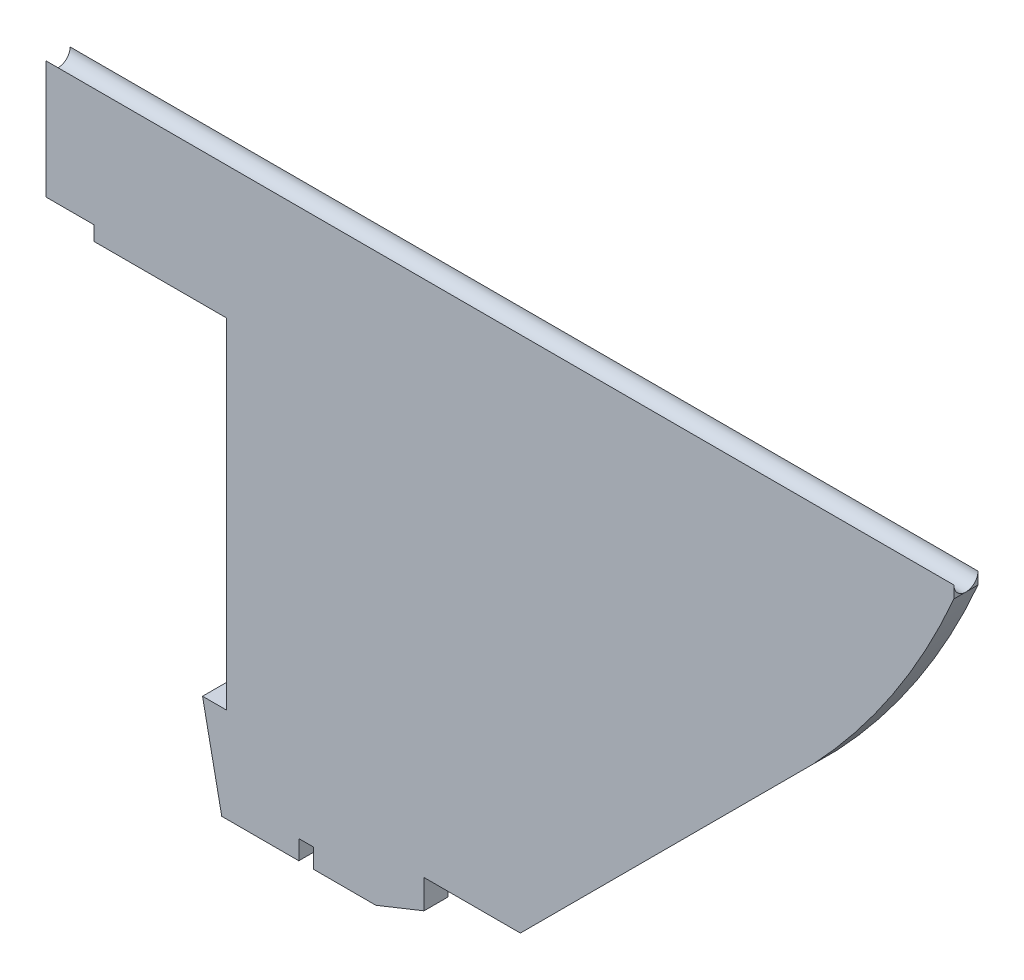
ISO-10303-21;
HEADER;
FILE_DESCRIPTION(('STEP AP214'),'2;1');
FILE_NAME('part.step','',(''),(''),'','','');
FILE_SCHEMA(('AUTOMOTIVE_DESIGN { 1 0 10303 214 1 1 1 1 }'));
ENDSEC;
DATA;
#1=APPLICATION_CONTEXT('core data for automotive mechanical design processes');
#2=APPLICATION_PROTOCOL_DEFINITION('international standard','automotive_design',2000,#1);
#3=PRODUCT_CONTEXT('',#1,'mechanical');
#4=PRODUCT('Part','Part','',(#3));
#5=PRODUCT_RELATED_PRODUCT_CATEGORY('part','',(#4));
#6=PRODUCT_DEFINITION_FORMATION('','',#4);
#7=PRODUCT_DEFINITION_CONTEXT('part definition',#1,'design');
#8=PRODUCT_DEFINITION('design','',#6,#7);
#9=PRODUCT_DEFINITION_SHAPE('','',#8);
#10=(LENGTH_UNIT() NAMED_UNIT(*) SI_UNIT(.MILLI.,.METRE.));
#11=(NAMED_UNIT(*) PLANE_ANGLE_UNIT() SI_UNIT($,.RADIAN.));
#12=(NAMED_UNIT(*) SI_UNIT($,.STERADIAN.) SOLID_ANGLE_UNIT());
#13=UNCERTAINTY_MEASURE_WITH_UNIT(LENGTH_MEASURE(1.E-05),#10,'distance_accuracy_value','');
#14=(GEOMETRIC_REPRESENTATION_CONTEXT(3) GLOBAL_UNCERTAINTY_ASSIGNED_CONTEXT((#13)) GLOBAL_UNIT_ASSIGNED_CONTEXT((#10,
#11,#12)) REPRESENTATION_CONTEXT('',''));
#15=CARTESIAN_POINT('',(0.,0.,0.));
#16=DIRECTION('',(0.,0.,1.));
#17=DIRECTION('',(1.,0.,0.));
#18=AXIS2_PLACEMENT_3D('',#15,#16,#17);
#19=CARTESIAN_POINT('',(36.4873586883436,-115.098494092417,5.));
#20=DIRECTION('',(0.,1.,0.));
#21=DIRECTION('',(0.,0.,1.));
#22=AXIS2_PLACEMENT_3D('',#19,#20,#21);
#23=PLANE('',#22);
#24=DIRECTION('',(1.,0.,0.));
#25=VECTOR('',#24,1.);
#26=CARTESIAN_POINT('',(36.4873586883436,-115.098494092417,5.));
#27=LINE('',#26,#25);
#28=CARTESIAN_POINT('',(55.4873586883436,-115.098494092417,5.));
#29=VERTEX_POINT('',#28);
#30=CARTESIAN_POINT('',(68.4873586883436,-115.098494092417,5.));
#31=VERTEX_POINT('',#30);
#32=EDGE_CURVE('E210',#29,#31,#27,.T.);
#33=ORIENTED_EDGE('',*,*,#32,.F.);
#34=DIRECTION('',(0.,0.,-1.));
#35=VECTOR('',#34,1.);
#36=CARTESIAN_POINT('',(55.4873586883436,-115.098494092417,5.));
#37=LINE('',#36,#35);
#38=CARTESIAN_POINT('',(55.4873586883436,-115.098494092417,0.));
#39=VERTEX_POINT('',#38);
#40=EDGE_CURVE('E195',#29,#39,#37,.T.);
#41=ORIENTED_EDGE('',*,*,#40,.T.);
#42=DIRECTION('',(1.,0.,0.));
#43=VECTOR('',#42,1.);
#44=CARTESIAN_POINT('',(36.4873586883436,-115.098494092417,0.));
#45=LINE('',#44,#43);
#46=CARTESIAN_POINT('',(68.4873586883436,-115.098494092417,0.));
#47=VERTEX_POINT('',#46);
#48=EDGE_CURVE('E255',#39,#47,#45,.T.);
#49=ORIENTED_EDGE('',*,*,#48,.T.);
#50=DIRECTION('',(0.,0.,1.));
#51=VECTOR('',#50,1.);
#52=CARTESIAN_POINT('',(68.4873586883436,-115.098494092417,0.));
#53=LINE('',#52,#51);
#54=EDGE_CURVE('E219',#47,#31,#53,.T.);
#55=ORIENTED_EDGE('',*,*,#54,.T.);
#56=EDGE_LOOP('',(#33,#41,#49,#55));
#57=FACE_BOUND('',#56,.T.);
#58=ADVANCED_FACE('F59',(#57),#23,.F.);
#59=CARTESIAN_POINT('',(0.,0.,5.));
#60=DIRECTION('',(1.,0.,0.));
#61=DIRECTION('',(0.,1.,0.));
#62=AXIS2_PLACEMENT_3D('',#59,#60,#61);
#63=PLANE('',#62);
#64=DIRECTION('',(0.,-1.,0.));
#65=VECTOR('',#64,1.);
#66=CARTESIAN_POINT('',(0.,0.,0.));
#67=LINE('',#66,#65);
#68=CARTESIAN_POINT('',(0.,2.5,0.));
#69=VERTEX_POINT('',#68);
#70=CARTESIAN_POINT('',(0.,-22.,0.));
#71=VERTEX_POINT('',#70);
#72=EDGE_CURVE('E238',#69,#71,#67,.T.);
#73=ORIENTED_EDGE('',*,*,#72,.T.);
#74=DIRECTION('',(0.,0.,1.));
#75=VECTOR('',#74,1.);
#76=CARTESIAN_POINT('',(0.,-22.,0.));
#77=LINE('',#76,#75);
#78=CARTESIAN_POINT('',(0.,-22.,5.));
#79=VERTEX_POINT('',#78);
#80=EDGE_CURVE('E243',#71,#79,#77,.T.);
#81=ORIENTED_EDGE('',*,*,#80,.T.);
#82=DIRECTION('',(0.,-1.,0.));
#83=VECTOR('',#82,1.);
#84=CARTESIAN_POINT('',(0.,0.,5.));
#85=LINE('',#84,#83);
#86=CARTESIAN_POINT('',(0.,2.5,5.));
#87=VERTEX_POINT('',#86);
#88=EDGE_CURVE('E267',#87,#79,#85,.T.);
#89=ORIENTED_EDGE('',*,*,#88,.F.);
#90=CARTESIAN_POINT('',(0.,2.5,2.5));
#91=DIRECTION('',(-1.,0.,0.));
#92=DIRECTION('',(0.,-1.,0.));
#93=AXIS2_PLACEMENT_3D('',#90,#91,#92);
#94=CIRCLE('',#93,2.5);
#95=EDGE_CURVE('E379',#69,#87,#94,.T.);
#96=ORIENTED_EDGE('',*,*,#95,.F.);
#97=EDGE_LOOP('',(#73,#81,#89,#96));
#98=FACE_BOUND('',#97,.T.);
#99=ADVANCED_FACE('F61',(#98),#63,.F.);
#100=CARTESIAN_POINT('',(0.,-25.,5.));
#101=DIRECTION('',(0.,1.,0.));
#102=DIRECTION('',(0.,0.,1.));
#103=AXIS2_PLACEMENT_3D('',#100,#101,#102);
#104=PLANE('',#103);
#105=DIRECTION('',(1.,0.,0.));
#106=VECTOR('',#105,1.);
#107=CARTESIAN_POINT('',(0.,-25.,5.));
#108=LINE('',#107,#106);
#109=CARTESIAN_POINT('',(10.,-25.,5.));
#110=VERTEX_POINT('',#109);
#111=CARTESIAN_POINT('',(37.5,-25.,5.));
#112=VERTEX_POINT('',#111);
#113=EDGE_CURVE('E306',#110,#112,#108,.T.);
#114=ORIENTED_EDGE('',*,*,#113,.F.);
#115=DIRECTION('',(0.,0.,1.));
#116=VECTOR('',#115,1.);
#117=CARTESIAN_POINT('',(10.,-25.,0.));
#118=LINE('',#117,#116);
#119=CARTESIAN_POINT('',(10.,-25.,0.));
#120=VERTEX_POINT('',#119);
#121=EDGE_CURVE('E314',#120,#110,#118,.T.);
#122=ORIENTED_EDGE('',*,*,#121,.F.);
#123=DIRECTION('',(1.,0.,0.));
#124=VECTOR('',#123,1.);
#125=CARTESIAN_POINT('',(0.,-25.,0.));
#126=LINE('',#125,#124);
#127=CARTESIAN_POINT('',(37.5,-25.,0.));
#128=VERTEX_POINT('',#127);
#129=EDGE_CURVE('E242',#120,#128,#126,.T.);
#130=ORIENTED_EDGE('',*,*,#129,.T.);
#131=DIRECTION('',(0.,0.,-1.));
#132=VECTOR('',#131,1.);
#133=CARTESIAN_POINT('',(37.5,-25.,5.));
#134=LINE('',#133,#132);
#135=EDGE_CURVE('E12',#112,#128,#134,.T.);
#136=ORIENTED_EDGE('',*,*,#135,.F.);
#137=EDGE_LOOP('',(#114,#122,#130,#136));
#138=FACE_BOUND('',#137,.T.);
#139=ADVANCED_FACE('F434',(#138),#104,.F.);
#140=CARTESIAN_POINT('',(37.5,-25.,5.));
#141=DIRECTION('',(1.,0.,0.));
#142=DIRECTION('',(0.,1.,0.));
#143=AXIS2_PLACEMENT_3D('',#140,#141,#142);
#144=PLANE('',#143);
#145=DIRECTION('',(0.,-1.,0.));
#146=VECTOR('',#145,1.);
#147=CARTESIAN_POINT('',(37.5,-25.,0.));
#148=LINE('',#147,#146);
#149=CARTESIAN_POINT('',(37.4999999999998,-95.5,0.));
#150=VERTEX_POINT('',#149);
#151=EDGE_CURVE('E246',#128,#150,#148,.T.);
#152=ORIENTED_EDGE('',*,*,#151,.T.);
#153=DIRECTION('',(0.,0.,-1.));
#154=VECTOR('',#153,1.);
#155=CARTESIAN_POINT('',(37.4999999999998,-95.5,5.));
#156=LINE('',#155,#154);
#157=CARTESIAN_POINT('',(37.4999999999998,-95.5,5.));
#158=VERTEX_POINT('',#157);
#159=EDGE_CURVE('E68',#158,#150,#156,.T.);
#160=ORIENTED_EDGE('',*,*,#159,.F.);
#161=DIRECTION('',(0.,-1.,0.));
#162=VECTOR('',#161,1.);
#163=CARTESIAN_POINT('',(37.5,-25.,5.));
#164=LINE('',#163,#162);
#165=EDGE_CURVE('E302',#112,#158,#164,.T.);
#166=ORIENTED_EDGE('',*,*,#165,.F.);
#167=ORIENTED_EDGE('',*,*,#135,.T.);
#168=EDGE_LOOP('',(#152,#160,#166,#167));
#169=FACE_BOUND('',#168,.T.);
#170=ADVANCED_FACE('F449',(#169),#144,.F.);
#171=CARTESIAN_POINT('',(37.4999999999998,-95.5,5.));
#172=DIRECTION('',(0.,-1.,0.));
#173=DIRECTION('',(1.,0.,0.));
#174=AXIS2_PLACEMENT_3D('',#171,#172,#173);
#175=PLANE('',#174);
#176=DIRECTION('',(-1.,0.,0.));
#177=VECTOR('',#176,1.);
#178=CARTESIAN_POINT('',(37.4999999999998,-95.5,0.));
#179=LINE('',#178,#177);
#180=CARTESIAN_POINT('',(32.4999999999998,-95.5,0.));
#181=VERTEX_POINT('',#180);
#182=EDGE_CURVE('E249',#150,#181,#179,.T.);
#183=ORIENTED_EDGE('',*,*,#182,.T.);
#184=DIRECTION('',(0.,0.,-1.));
#185=VECTOR('',#184,1.);
#186=CARTESIAN_POINT('',(32.4999999999998,-95.5,5.));
#187=LINE('',#186,#185);
#188=CARTESIAN_POINT('',(32.4999999999998,-95.5,5.));
#189=VERTEX_POINT('',#188);
#190=EDGE_CURVE('E275',#189,#181,#187,.T.);
#191=ORIENTED_EDGE('',*,*,#190,.F.);
#192=DIRECTION('',(-1.,0.,0.));
#193=VECTOR('',#192,1.);
#194=CARTESIAN_POINT('',(37.4999999999998,-95.5,5.));
#195=LINE('',#194,#193);
#196=EDGE_CURVE('E227',#158,#189,#195,.T.);
#197=ORIENTED_EDGE('',*,*,#196,.F.);
#198=ORIENTED_EDGE('',*,*,#159,.T.);
#199=EDGE_LOOP('',(#183,#191,#197,#198));
#200=FACE_BOUND('',#199,.T.);
#201=ADVANCED_FACE('F285',(#200),#175,.F.);
#202=CARTESIAN_POINT('',(32.4999999999998,-95.5,5.));
#203=DIRECTION('',(0.979924704620831,0.199367934417191,0.));
#204=DIRECTION('',(-0.199367934417191,0.979924704620831,0.));
#205=AXIS2_PLACEMENT_3D('',#202,#203,#204);
#206=PLANE('',#205);
#207=DIRECTION('',(0.199367934417191,-0.979924704620831,0.));
#208=VECTOR('',#207,1.);
#209=CARTESIAN_POINT('',(32.4999999999998,-95.5,0.));
#210=LINE('',#209,#208);
#211=CARTESIAN_POINT('',(36.4873586883436,-115.098494092417,0.));
#212=VERTEX_POINT('',#211);
#213=EDGE_CURVE('E252',#181,#212,#210,.T.);
#214=ORIENTED_EDGE('',*,*,#213,.T.);
#215=DIRECTION('',(0.,0.,-1.));
#216=VECTOR('',#215,1.);
#217=CARTESIAN_POINT('',(36.4873586883436,-115.098494092417,5.));
#218=LINE('',#217,#216);
#219=CARTESIAN_POINT('',(36.4873586883436,-115.098494092417,5.));
#220=VERTEX_POINT('',#219);
#221=EDGE_CURVE('E271',#220,#212,#218,.T.);
#222=ORIENTED_EDGE('',*,*,#221,.F.);
#223=DIRECTION('',(0.199367934417191,-0.979924704620831,0.));
#224=VECTOR('',#223,1.);
#225=CARTESIAN_POINT('',(32.4999999999998,-95.5,5.));
#226=LINE('',#225,#224);
#227=EDGE_CURVE('E221',#189,#220,#226,.T.);
#228=ORIENTED_EDGE('',*,*,#227,.F.);
#229=ORIENTED_EDGE('',*,*,#190,.T.);
#230=EDGE_LOOP('',(#214,#222,#228,#229));
#231=FACE_BOUND('',#230,.T.);
#232=ADVANCED_FACE('F297',(#231),#206,.F.);
#233=CARTESIAN_POINT('',(52.4873586883436,-115.098494092417,0.));
#234=VERTEX_POINT('',#233);
#235=EDGE_CURVE('E256',#212,#234,#45,.T.);
#236=ORIENTED_EDGE('',*,*,#235,.T.);
#237=DIRECTION('',(0.,0.,-1.));
#238=VECTOR('',#237,1.);
#239=CARTESIAN_POINT('',(52.4873586883436,-115.098494092417,5.));
#240=LINE('',#239,#238);
#241=CARTESIAN_POINT('',(52.4873586883436,-115.098494092417,5.));
#242=VERTEX_POINT('',#241);
#243=EDGE_CURVE('E75',#242,#234,#240,.T.);
#244=ORIENTED_EDGE('',*,*,#243,.F.);
#245=EDGE_CURVE('E220',#220,#242,#27,.T.);
#246=ORIENTED_EDGE('',*,*,#245,.F.);
#247=ORIENTED_EDGE('',*,*,#221,.T.);
#248=EDGE_LOOP('',(#236,#244,#246,#247));
#249=FACE_BOUND('',#248,.T.);
#250=ADVANCED_FACE('F301',(#249),#23,.F.);
#251=CARTESIAN_POINT('',(88.4873586883436,-115.098494092417,5.));
#252=DIRECTION('',(-0.707106781186549,0.707106781186546,0.));
#253=DIRECTION('',(-0.707106781186546,-0.707106781186549,0.));
#254=AXIS2_PLACEMENT_3D('',#251,#252,#253);
#255=PLANE('',#254);
#256=DIRECTION('',(0.707106781186546,0.707106781186549,0.));
#257=VECTOR('',#256,1.);
#258=CARTESIAN_POINT('',(88.4873586883436,-115.098494092417,5.));
#259=LINE('',#258,#257);
#260=CARTESIAN_POINT('',(98.4873586883435,-105.098494092417,5.));
#261=VERTEX_POINT('',#260);
#262=CARTESIAN_POINT('',(159.198036806998,-44.3878159737617,5.));
#263=VERTEX_POINT('',#262);
#264=EDGE_CURVE('E225',#261,#263,#259,.T.);
#265=ORIENTED_EDGE('',*,*,#264,.F.);
#266=DIRECTION('',(0.,0.,1.));
#267=VECTOR('',#266,1.);
#268=CARTESIAN_POINT('',(98.4873586883435,-105.098494092417,0.));
#269=LINE('',#268,#267);
#270=CARTESIAN_POINT('',(98.4873586883435,-105.098494092417,0.));
#271=VERTEX_POINT('',#270);
#272=EDGE_CURVE('E338',#271,#261,#269,.T.);
#273=ORIENTED_EDGE('',*,*,#272,.F.);
#274=DIRECTION('',(0.707106781186546,0.707106781186549,0.));
#275=VECTOR('',#274,1.);
#276=CARTESIAN_POINT('',(88.4873586883436,-115.098494092417,0.));
#277=LINE('',#276,#275);
#278=CARTESIAN_POINT('',(159.198036806998,-44.3878159737617,0.));
#279=VERTEX_POINT('',#278);
#280=EDGE_CURVE('E260',#271,#279,#277,.T.);
#281=ORIENTED_EDGE('',*,*,#280,.T.);
#282=DIRECTION('',(0.,0.,-1.));
#283=VECTOR('',#282,1.);
#284=CARTESIAN_POINT('',(159.198036806998,-44.3878159737617,5.));
#285=LINE('',#284,#283);
#286=EDGE_CURVE('E237',#263,#279,#285,.T.);
#287=ORIENTED_EDGE('',*,*,#286,.F.);
#288=EDGE_LOOP('',(#265,#273,#281,#287));
#289=FACE_BOUND('',#288,.T.);
#290=ADVANCED_FACE('F438',(#289),#255,.F.);
#291=CARTESIAN_POINT('',(49.0804526377718,60.1702237350326,5.));
#292=DIRECTION('',(0.,0.,-1.));
#293=DIRECTION('',(-1.,0.,0.));
#294=AXIS2_PLACEMENT_3D('',#291,#292,#293);
#295=CYLINDRICAL_SURFACE('',#294,151.849484724224);
#296=CARTESIAN_POINT('',(49.0804526377718,60.1702237350326,0.));
#297=DIRECTION('',(0.,0.,1.));
#298=DIRECTION('',(1.,0.,0.));
#299=AXIS2_PLACEMENT_3D('',#296,#297,#298);
#300=CIRCLE('',#299,151.849484724224);
#301=CARTESIAN_POINT('',(188.5,0.,0.));
#302=VERTEX_POINT('',#301);
#303=EDGE_CURVE('E263',#279,#302,#300,.T.);
#304=ORIENTED_EDGE('',*,*,#303,.T.);
#305=DIRECTION('',(0.,0.,1.));
#306=VECTOR('',#305,1.);
#307=CARTESIAN_POINT('',(188.5,0.,0.));
#308=LINE('',#307,#306);
#309=CARTESIAN_POINT('',(188.5,0.,2.5));
#310=VERTEX_POINT('',#309);
#311=EDGE_CURVE('E362',#302,#310,#308,.T.);
#312=ORIENTED_EDGE('',*,*,#311,.T.);
#313=DIRECTION('',(0.,0.,-1.));
#314=VECTOR('',#313,1.);
#315=CARTESIAN_POINT('',(188.5,0.,0.));
#316=LINE('',#315,#314);
#317=CARTESIAN_POINT('',(188.5,0.,5.));
#318=VERTEX_POINT('',#317);
#319=EDGE_CURVE('E388',#318,#310,#316,.T.);
#320=ORIENTED_EDGE('',*,*,#319,.F.);
#321=CARTESIAN_POINT('',(49.0804526377718,60.1702237350326,5.));
#322=DIRECTION('',(0.,0.,1.));
#323=DIRECTION('',(1.,0.,0.));
#324=AXIS2_PLACEMENT_3D('',#321,#322,#323);
#325=CIRCLE('',#324,151.849484724224);
#326=EDGE_CURVE('E233',#263,#318,#325,.T.);
#327=ORIENTED_EDGE('',*,*,#326,.F.);
#328=ORIENTED_EDGE('',*,*,#286,.T.);
#329=EDGE_LOOP('',(#304,#312,#320,#327,#328));
#330=FACE_BOUND('',#329,.T.);
#331=ADVANCED_FACE('F443',(#330),#295,.T.);
#332=CARTESIAN_POINT('',(44.,0.,5.));
#333=DIRECTION('',(0.,0.,-1.));
#334=DIRECTION('',(-1.,0.,0.));
#335=AXIS2_PLACEMENT_3D('',#332,#333,#334);
#336=PLANE('',#335);
#337=DIRECTION('',(1.,0.,0.));
#338=VECTOR('',#337,1.);
#339=CARTESIAN_POINT('',(55.4873586883436,-111.098494092417,5.));
#340=LINE('',#339,#338);
#341=CARTESIAN_POINT('',(52.4873586883436,-111.098494092417,5.));
#342=VERTEX_POINT('',#341);
#343=CARTESIAN_POINT('',(55.4873586883436,-111.098494092417,5.));
#344=VERTEX_POINT('',#343);
#345=EDGE_CURVE('E205',#342,#344,#340,.T.);
#346=ORIENTED_EDGE('',*,*,#345,.T.);
#347=DIRECTION('',(0.,-1.,0.));
#348=VECTOR('',#347,1.);
#349=CARTESIAN_POINT('',(55.4873586883436,-111.098494092417,5.));
#350=LINE('',#349,#348);
#351=EDGE_CURVE('E198',#344,#29,#350,.T.);
#352=ORIENTED_EDGE('',*,*,#351,.T.);
#353=ORIENTED_EDGE('',*,*,#32,.T.);
#354=DIRECTION('',(-0.928476690885259,-0.371390676354104,0.));
#355=VECTOR('',#354,1.);
#356=CARTESIAN_POINT('',(78.4873586883436,-111.098494092417,5.));
#357=LINE('',#356,#355);
#358=CARTESIAN_POINT('',(78.4873586883436,-111.098494092417,5.));
#359=VERTEX_POINT('',#358);
#360=EDGE_CURVE('E350',#359,#31,#357,.T.);
#361=ORIENTED_EDGE('',*,*,#360,.F.);
#362=DIRECTION('',(0.,-1.,0.));
#363=VECTOR('',#362,1.);
#364=CARTESIAN_POINT('',(78.4873586883436,-105.098494092417,5.));
#365=LINE('',#364,#363);
#366=CARTESIAN_POINT('',(78.4873586883436,-105.098494092417,5.));
#367=VERTEX_POINT('',#366);
#368=EDGE_CURVE('E354',#367,#359,#365,.T.);
#369=ORIENTED_EDGE('',*,*,#368,.F.);
#370=DIRECTION('',(-1.,0.,0.));
#371=VECTOR('',#370,1.);
#372=CARTESIAN_POINT('',(88.4873586883436,-105.098494092417,5.));
#373=LINE('',#372,#371);
#374=EDGE_CURVE('E358',#261,#367,#373,.T.);
#375=ORIENTED_EDGE('',*,*,#374,.F.);
#376=ORIENTED_EDGE('',*,*,#264,.T.);
#377=ORIENTED_EDGE('',*,*,#326,.T.);
#378=DIRECTION('',(0.,1.,0.));
#379=VECTOR('',#378,1.);
#380=CARTESIAN_POINT('',(188.5,0.,5.));
#381=LINE('',#380,#379);
#382=CARTESIAN_POINT('',(188.5,2.5,5.));
#383=VERTEX_POINT('',#382);
#384=EDGE_CURVE('E378',#318,#383,#381,.T.);
#385=ORIENTED_EDGE('',*,*,#384,.T.);
#386=DIRECTION('',(-1.,0.,0.));
#387=VECTOR('',#386,1.);
#388=CARTESIAN_POINT('',(188.5,2.5,5.));
#389=LINE('',#388,#387);
#390=EDGE_CURVE('E374',#383,#87,#389,.T.);
#391=ORIENTED_EDGE('',*,*,#390,.T.);
#392=ORIENTED_EDGE('',*,*,#88,.T.);
#393=DIRECTION('',(-1.,0.,0.));
#394=VECTOR('',#393,1.);
#395=CARTESIAN_POINT('',(0.,-22.,5.));
#396=LINE('',#395,#394);
#397=CARTESIAN_POINT('',(10.,-22.,5.));
#398=VERTEX_POINT('',#397);
#399=EDGE_CURVE('E324',#398,#79,#396,.T.);
#400=ORIENTED_EDGE('',*,*,#399,.F.);
#401=DIRECTION('',(0.,1.,0.));
#402=VECTOR('',#401,1.);
#403=CARTESIAN_POINT('',(10.,-25.,5.));
#404=LINE('',#403,#402);
#405=EDGE_CURVE('E328',#110,#398,#404,.T.);
#406=ORIENTED_EDGE('',*,*,#405,.F.);
#407=ORIENTED_EDGE('',*,*,#113,.T.);
#408=ORIENTED_EDGE('',*,*,#165,.T.);
#409=ORIENTED_EDGE('',*,*,#196,.T.);
#410=ORIENTED_EDGE('',*,*,#227,.T.);
#411=ORIENTED_EDGE('',*,*,#245,.T.);
#412=DIRECTION('',(0.,1.,0.));
#413=VECTOR('',#412,1.);
#414=CARTESIAN_POINT('',(52.4873586883436,-111.098494092417,5.));
#415=LINE('',#414,#413);
#416=EDGE_CURVE('E214',#242,#342,#415,.T.);
#417=ORIENTED_EDGE('',*,*,#416,.T.);
#418=EDGE_LOOP('',(#346,#352,#353,#361,#369,#375,#376,#377,#385,#391,#392,#400,#406,#407,#408,
#409,#410,#411,#417));
#419=FACE_BOUND('',#418,.T.);
#420=ADVANCED_FACE('F208',(#419),#336,.F.);
#421=CARTESIAN_POINT('',(44.,0.,0.));
#422=DIRECTION('',(0.,0.,-1.));
#423=DIRECTION('',(-1.,0.,0.));
#424=AXIS2_PLACEMENT_3D('',#421,#422,#423);
#425=PLANE('',#424);
#426=DIRECTION('',(0.,-1.,0.));
#427=VECTOR('',#426,1.);
#428=CARTESIAN_POINT('',(55.4873586883436,-111.098494092417,0.));
#429=LINE('',#428,#427);
#430=CARTESIAN_POINT('',(55.4873586883436,-111.098494092417,0.));
#431=VERTEX_POINT('',#430);
#432=EDGE_CURVE('E201',#431,#39,#429,.T.);
#433=ORIENTED_EDGE('',*,*,#432,.F.);
#434=DIRECTION('',(1.,0.,0.));
#435=VECTOR('',#434,1.);
#436=CARTESIAN_POINT('',(55.4873586883436,-111.098494092417,0.));
#437=LINE('',#436,#435);
#438=CARTESIAN_POINT('',(52.4873586883436,-111.098494092417,0.));
#439=VERTEX_POINT('',#438);
#440=EDGE_CURVE('E215',#439,#431,#437,.T.);
#441=ORIENTED_EDGE('',*,*,#440,.F.);
#442=DIRECTION('',(0.,1.,0.));
#443=VECTOR('',#442,1.);
#444=CARTESIAN_POINT('',(52.4873586883436,-111.098494092417,0.));
#445=LINE('',#444,#443);
#446=EDGE_CURVE('E410',#234,#439,#445,.T.);
#447=ORIENTED_EDGE('',*,*,#446,.F.);
#448=ORIENTED_EDGE('',*,*,#235,.F.);
#449=ORIENTED_EDGE('',*,*,#213,.F.);
#450=ORIENTED_EDGE('',*,*,#182,.F.);
#451=ORIENTED_EDGE('',*,*,#151,.F.);
#452=ORIENTED_EDGE('',*,*,#129,.F.);
#453=DIRECTION('',(0.,1.,0.));
#454=VECTOR('',#453,1.);
#455=CARTESIAN_POINT('',(10.,-25.,0.));
#456=LINE('',#455,#454);
#457=CARTESIAN_POINT('',(10.,-22.,0.));
#458=VERTEX_POINT('',#457);
#459=EDGE_CURVE('E327',#120,#458,#456,.T.);
#460=ORIENTED_EDGE('',*,*,#459,.T.);
#461=DIRECTION('',(-1.,0.,0.));
#462=VECTOR('',#461,1.);
#463=CARTESIAN_POINT('',(0.,-22.,0.));
#464=LINE('',#463,#462);
#465=EDGE_CURVE('E318',#458,#71,#464,.T.);
#466=ORIENTED_EDGE('',*,*,#465,.T.);
#467=ORIENTED_EDGE('',*,*,#72,.F.);
#468=DIRECTION('',(-1.,0.,0.));
#469=VECTOR('',#468,1.);
#470=CARTESIAN_POINT('',(188.5,2.5,0.));
#471=LINE('',#470,#469);
#472=CARTESIAN_POINT('',(188.5,2.5,0.));
#473=VERTEX_POINT('',#472);
#474=EDGE_CURVE('E397',#473,#69,#471,.T.);
#475=ORIENTED_EDGE('',*,*,#474,.F.);
#476=DIRECTION('',(0.,1.,0.));
#477=VECTOR('',#476,1.);
#478=CARTESIAN_POINT('',(188.5,0.,0.));
#479=LINE('',#478,#477);
#480=EDGE_CURVE('E384',#302,#473,#479,.T.);
#481=ORIENTED_EDGE('',*,*,#480,.F.);
#482=ORIENTED_EDGE('',*,*,#303,.F.);
#483=ORIENTED_EDGE('',*,*,#280,.F.);
#484=DIRECTION('',(-1.,0.,0.));
#485=VECTOR('',#484,1.);
#486=CARTESIAN_POINT('',(88.4873586883436,-105.098494092417,0.));
#487=LINE('',#486,#485);
#488=CARTESIAN_POINT('',(78.4873586883436,-105.098494092417,0.));
#489=VERTEX_POINT('',#488);
#490=EDGE_CURVE('E353',#271,#489,#487,.T.);
#491=ORIENTED_EDGE('',*,*,#490,.T.);
#492=DIRECTION('',(0.,-1.,0.));
#493=VECTOR('',#492,1.);
#494=CARTESIAN_POINT('',(78.4873586883436,-105.098494092417,0.));
#495=LINE('',#494,#493);
#496=CARTESIAN_POINT('',(78.4873586883436,-111.098494092417,0.));
#497=VERTEX_POINT('',#496);
#498=EDGE_CURVE('E83',#489,#497,#495,.T.);
#499=ORIENTED_EDGE('',*,*,#498,.T.);
#500=DIRECTION('',(-0.928476690885259,-0.371390676354104,0.));
#501=VECTOR('',#500,1.);
#502=CARTESIAN_POINT('',(78.4873586883436,-111.098494092417,0.));
#503=LINE('',#502,#501);
#504=EDGE_CURVE('E342',#497,#47,#503,.T.);
#505=ORIENTED_EDGE('',*,*,#504,.T.);
#506=ORIENTED_EDGE('',*,*,#48,.F.);
#507=EDGE_LOOP('',(#433,#441,#447,#448,#449,#450,#451,#452,#460,#466,#467,#475,#481,#482,#483,
#491,#499,#505,#506));
#508=FACE_BOUND('',#507,.T.);
#509=ADVANCED_FACE('F292',(#508),#425,.T.);
#510=CARTESIAN_POINT('',(0.,-22.,0.));
#511=DIRECTION('',(0.,1.,0.));
#512=DIRECTION('',(0.,0.,1.));
#513=AXIS2_PLACEMENT_3D('',#510,#511,#512);
#514=PLANE('',#513);
#515=ORIENTED_EDGE('',*,*,#399,.T.);
#516=ORIENTED_EDGE('',*,*,#80,.F.);
#517=ORIENTED_EDGE('',*,*,#465,.F.);
#518=DIRECTION('',(0.,0.,1.));
#519=VECTOR('',#518,1.);
#520=CARTESIAN_POINT('',(10.,-22.,0.));
#521=LINE('',#520,#519);
#522=EDGE_CURVE('E317',#458,#398,#521,.T.);
#523=ORIENTED_EDGE('',*,*,#522,.T.);
#524=EDGE_LOOP('',(#515,#516,#517,#523));
#525=FACE_BOUND('',#524,.T.);
#526=ADVANCED_FACE('F498',(#525),#514,.F.);
#527=CARTESIAN_POINT('',(10.,-25.,0.));
#528=DIRECTION('',(1.,0.,0.));
#529=DIRECTION('',(0.,0.,-1.));
#530=AXIS2_PLACEMENT_3D('',#527,#528,#529);
#531=PLANE('',#530);
#532=ORIENTED_EDGE('',*,*,#405,.T.);
#533=ORIENTED_EDGE('',*,*,#522,.F.);
#534=ORIENTED_EDGE('',*,*,#459,.F.);
#535=ORIENTED_EDGE('',*,*,#121,.T.);
#536=EDGE_LOOP('',(#532,#533,#534,#535));
#537=FACE_BOUND('',#536,.T.);
#538=ADVANCED_FACE('F464',(#537),#531,.F.);
#539=CARTESIAN_POINT('',(78.4873586883436,-111.098494092417,0.));
#540=DIRECTION('',(-0.371390676354104,0.928476690885259,0.));
#541=DIRECTION('',(-0.928476690885259,-0.371390676354104,0.));
#542=AXIS2_PLACEMENT_3D('',#539,#540,#541);
#543=PLANE('',#542);
#544=ORIENTED_EDGE('',*,*,#360,.T.);
#545=ORIENTED_EDGE('',*,*,#54,.F.);
#546=ORIENTED_EDGE('',*,*,#504,.F.);
#547=DIRECTION('',(0.,0.,1.));
#548=VECTOR('',#547,1.);
#549=CARTESIAN_POINT('',(78.4873586883436,-111.098494092417,0.));
#550=LINE('',#549,#548);
#551=EDGE_CURVE('E345',#497,#359,#550,.T.);
#552=ORIENTED_EDGE('',*,*,#551,.T.);
#553=EDGE_LOOP('',(#544,#545,#546,#552));
#554=FACE_BOUND('',#553,.T.);
#555=ADVANCED_FACE('F490',(#554),#543,.F.);
#556=CARTESIAN_POINT('',(78.4873586883436,-105.098494092417,0.));
#557=DIRECTION('',(-1.,0.,0.));
#558=DIRECTION('',(0.,0.,1.));
#559=AXIS2_PLACEMENT_3D('',#556,#557,#558);
#560=PLANE('',#559);
#561=ORIENTED_EDGE('',*,*,#368,.T.);
#562=ORIENTED_EDGE('',*,*,#551,.F.);
#563=ORIENTED_EDGE('',*,*,#498,.F.);
#564=DIRECTION('',(0.,0.,1.));
#565=VECTOR('',#564,1.);
#566=CARTESIAN_POINT('',(78.4873586883436,-105.098494092417,0.));
#567=LINE('',#566,#565);
#568=EDGE_CURVE('E341',#489,#367,#567,.T.);
#569=ORIENTED_EDGE('',*,*,#568,.T.);
#570=EDGE_LOOP('',(#561,#562,#563,#569));
#571=FACE_BOUND('',#570,.T.);
#572=ADVANCED_FACE('F487',(#571),#560,.F.);
#573=CARTESIAN_POINT('',(88.4873586883436,-105.098494092417,0.));
#574=DIRECTION('',(0.,1.,0.));
#575=DIRECTION('',(0.,0.,1.));
#576=AXIS2_PLACEMENT_3D('',#573,#574,#575);
#577=PLANE('',#576);
#578=ORIENTED_EDGE('',*,*,#374,.T.);
#579=ORIENTED_EDGE('',*,*,#568,.F.);
#580=ORIENTED_EDGE('',*,*,#490,.F.);
#581=ORIENTED_EDGE('',*,*,#272,.T.);
#582=EDGE_LOOP('',(#578,#579,#580,#581));
#583=FACE_BOUND('',#582,.T.);
#584=ADVANCED_FACE('F484',(#583),#577,.F.);
#585=CARTESIAN_POINT('',(188.5,2.5,2.5));
#586=DIRECTION('',(-1.,0.,0.));
#587=DIRECTION('',(0.,0.,1.));
#588=AXIS2_PLACEMENT_3D('',#585,#586,#587);
#589=CYLINDRICAL_SURFACE('',#588,2.5);
#590=ORIENTED_EDGE('',*,*,#95,.T.);
#591=ORIENTED_EDGE('',*,*,#390,.F.);
#592=CARTESIAN_POINT('',(188.5,2.5,2.5));
#593=DIRECTION('',(-1.,0.,0.));
#594=DIRECTION('',(0.,-1.,0.));
#595=AXIS2_PLACEMENT_3D('',#592,#593,#594);
#596=CIRCLE('',#595,2.5);
#597=EDGE_CURVE('E383',#310,#383,#596,.T.);
#598=ORIENTED_EDGE('',*,*,#597,.F.);
#599=CARTESIAN_POINT('',(188.5,2.5,2.5));
#600=DIRECTION('',(-1.,0.,0.));
#601=DIRECTION('',(0.,-1.,0.));
#602=AXIS2_PLACEMENT_3D('',#599,#600,#601);
#603=CIRCLE('',#602,2.5);
#604=EDGE_CURVE('E394',#473,#310,#603,.T.);
#605=ORIENTED_EDGE('',*,*,#604,.F.);
#606=ORIENTED_EDGE('',*,*,#474,.T.);
#607=EDGE_LOOP('',(#590,#591,#598,#605,#606));
#608=FACE_BOUND('',#607,.T.);
#609=ADVANCED_FACE('F471',(#608),#589,.F.);
#610=CARTESIAN_POINT('',(188.5,0.,0.));
#611=DIRECTION('',(-1.,0.,0.));
#612=DIRECTION('',(0.,-1.,0.));
#613=AXIS2_PLACEMENT_3D('',#610,#611,#612);
#614=PLANE('',#613);
#615=ORIENTED_EDGE('',*,*,#597,.T.);
#616=ORIENTED_EDGE('',*,*,#384,.F.);
#617=ORIENTED_EDGE('',*,*,#319,.T.);
#618=EDGE_LOOP('',(#615,#616,#617));
#619=FACE_BOUND('',#618,.T.);
#620=ADVANCED_FACE('F606',(#619),#614,.F.);
#621=CARTESIAN_POINT('',(188.5,0.,0.));
#622=DIRECTION('',(-1.,0.,0.));
#623=DIRECTION('',(0.,-1.,0.));
#624=AXIS2_PLACEMENT_3D('',#621,#622,#623);
#625=PLANE('',#624);
#626=ORIENTED_EDGE('',*,*,#604,.T.);
#627=ORIENTED_EDGE('',*,*,#311,.F.);
#628=ORIENTED_EDGE('',*,*,#480,.T.);
#629=EDGE_LOOP('',(#626,#627,#628));
#630=FACE_BOUND('',#629,.T.);
#631=ADVANCED_FACE('F425',(#630),#625,.F.);
#632=CARTESIAN_POINT('',(55.4873586883436,-111.098494092417,5.));
#633=DIRECTION('',(1.,0.,0.));
#634=DIRECTION('',(0.,0.,-1.));
#635=AXIS2_PLACEMENT_3D('',#632,#633,#634);
#636=PLANE('',#635);
#637=ORIENTED_EDGE('',*,*,#432,.T.);
#638=ORIENTED_EDGE('',*,*,#40,.F.);
#639=ORIENTED_EDGE('',*,*,#351,.F.);
#640=DIRECTION('',(0.,0.,-1.));
#641=VECTOR('',#640,1.);
#642=CARTESIAN_POINT('',(55.4873586883436,-111.098494092417,5.));
#643=LINE('',#642,#641);
#644=EDGE_CURVE('E402',#344,#431,#643,.T.);
#645=ORIENTED_EDGE('',*,*,#644,.T.);
#646=EDGE_LOOP('',(#637,#638,#639,#645));
#647=FACE_BOUND('',#646,.T.);
#648=ADVANCED_FACE('F197',(#647),#636,.F.);
#649=CARTESIAN_POINT('',(55.4873586883436,-111.098494092417,5.));
#650=DIRECTION('',(0.,1.,0.));
#651=DIRECTION('',(0.,0.,1.));
#652=AXIS2_PLACEMENT_3D('',#649,#650,#651);
#653=PLANE('',#652);
#654=ORIENTED_EDGE('',*,*,#440,.T.);
#655=ORIENTED_EDGE('',*,*,#644,.F.);
#656=ORIENTED_EDGE('',*,*,#345,.F.);
#657=DIRECTION('',(0.,0.,-1.));
#658=VECTOR('',#657,1.);
#659=CARTESIAN_POINT('',(52.4873586883436,-111.098494092417,5.));
#660=LINE('',#659,#658);
#661=EDGE_CURVE('E405',#342,#439,#660,.T.);
#662=ORIENTED_EDGE('',*,*,#661,.T.);
#663=EDGE_LOOP('',(#654,#655,#656,#662));
#664=FACE_BOUND('',#663,.T.);
#665=ADVANCED_FACE('F417',(#664),#653,.F.);
#666=CARTESIAN_POINT('',(52.4873586883436,-111.098494092417,5.));
#667=DIRECTION('',(-1.,0.,0.));
#668=DIRECTION('',(0.,0.,1.));
#669=AXIS2_PLACEMENT_3D('',#666,#667,#668);
#670=PLANE('',#669);
#671=ORIENTED_EDGE('',*,*,#446,.T.);
#672=ORIENTED_EDGE('',*,*,#661,.F.);
#673=ORIENTED_EDGE('',*,*,#416,.F.);
#674=ORIENTED_EDGE('',*,*,#243,.T.);
#675=EDGE_LOOP('',(#671,#672,#673,#674));
#676=FACE_BOUND('',#675,.T.);
#677=ADVANCED_FACE('F415',(#676),#670,.F.);
#678=CLOSED_SHELL('',(#58,#99,#139,#170,#201,#232,#250,#290,#331,#420,#509,#526,#538,#555,#572,
#584,#609,#620,#631,#648,#665,#677));
#679=MANIFOLD_SOLID_BREP('B2',#678);
#680=ADVANCED_BREP_SHAPE_REPRESENTATION('',(#18,#679),#14);
#681=SHAPE_DEFINITION_REPRESENTATION(#9,#680);
ENDSEC;
END-ISO-10303-21;
